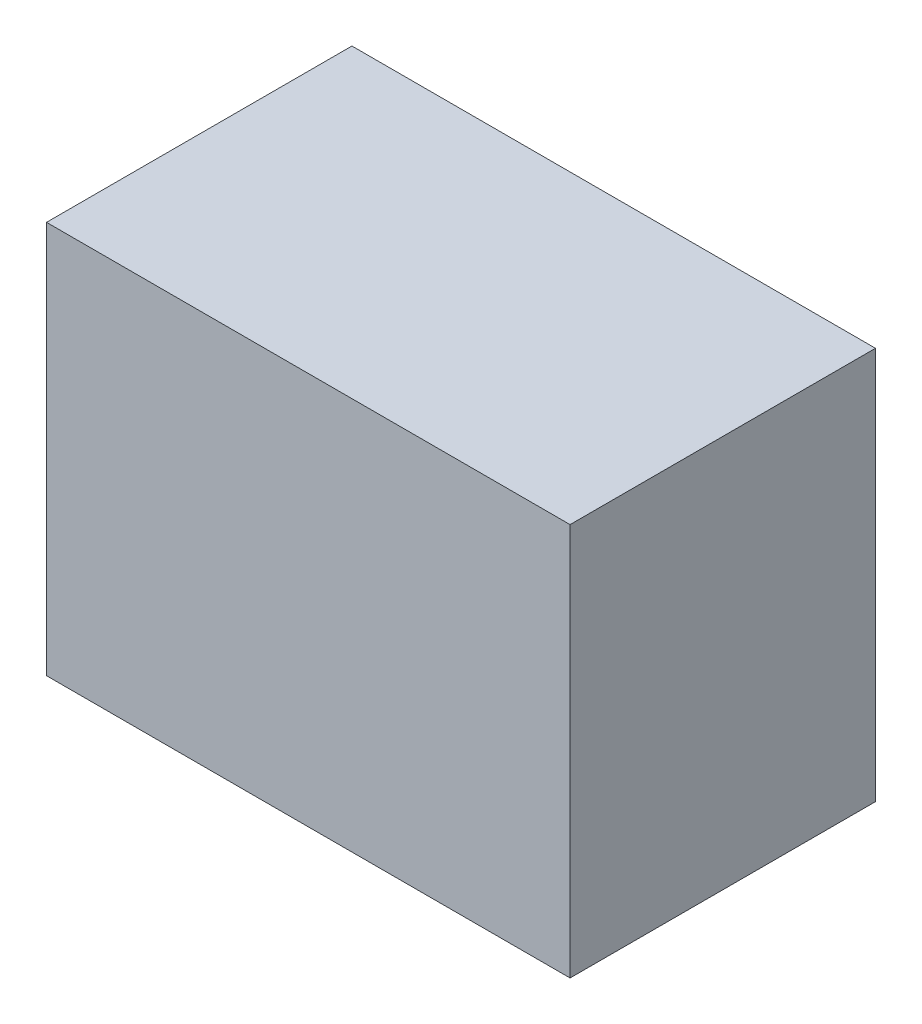
ISO-10303-21;
HEADER;
FILE_DESCRIPTION(('STEP AP214'),'2;1');
FILE_NAME('part.step','',(''),(''),'','','');
FILE_SCHEMA(('AUTOMOTIVE_DESIGN { 1 0 10303 214 1 1 1 1 }'));
ENDSEC;
DATA;
#1=APPLICATION_CONTEXT('core data for automotive mechanical design processes');
#2=APPLICATION_PROTOCOL_DEFINITION('international standard','automotive_design',2000,#1);
#3=PRODUCT_CONTEXT('',#1,'mechanical');
#4=PRODUCT('Part','Part','',(#3));
#5=PRODUCT_RELATED_PRODUCT_CATEGORY('part','',(#4));
#6=PRODUCT_DEFINITION_FORMATION('','',#4);
#7=PRODUCT_DEFINITION_CONTEXT('part definition',#1,'design');
#8=PRODUCT_DEFINITION('design','',#6,#7);
#9=PRODUCT_DEFINITION_SHAPE('','',#8);
#10=(LENGTH_UNIT() NAMED_UNIT(*) SI_UNIT(.MILLI.,.METRE.));
#11=(NAMED_UNIT(*) PLANE_ANGLE_UNIT() SI_UNIT($,.RADIAN.));
#12=(NAMED_UNIT(*) SI_UNIT($,.STERADIAN.) SOLID_ANGLE_UNIT());
#13=UNCERTAINTY_MEASURE_WITH_UNIT(LENGTH_MEASURE(1.E-05),#10,'distance_accuracy_value','');
#14=(GEOMETRIC_REPRESENTATION_CONTEXT(3) GLOBAL_UNCERTAINTY_ASSIGNED_CONTEXT((#13)) GLOBAL_UNIT_ASSIGNED_CONTEXT((#10,
#11,#12)) REPRESENTATION_CONTEXT('',''));
#15=CARTESIAN_POINT('',(0.,0.,0.));
#16=DIRECTION('',(0.,0.,1.));
#17=DIRECTION('',(1.,0.,0.));
#18=AXIS2_PLACEMENT_3D('',#15,#16,#17);
#19=CARTESIAN_POINT('',(152.4,228.6,88.9));
#20=DIRECTION('',(-1.,0.,0.));
#21=DIRECTION('',(0.,0.,1.));
#22=AXIS2_PLACEMENT_3D('',#19,#20,#21);
#23=PLANE('',#22);
#24=DIRECTION('',(0.,0.,-1.));
#25=VECTOR('',#24,1.);
#26=CARTESIAN_POINT('',(152.4,0.,88.9));
#27=LINE('',#26,#25);
#28=CARTESIAN_POINT('',(152.4,0.,88.9));
#29=VERTEX_POINT('',#28);
#30=CARTESIAN_POINT('',(152.4,0.,-88.9));
#31=VERTEX_POINT('',#30);
#32=EDGE_CURVE('E97',#29,#31,#27,.T.);
#33=ORIENTED_EDGE('',*,*,#32,.T.);
#34=DIRECTION('',(0.,-1.,0.));
#35=VECTOR('',#34,1.);
#36=CARTESIAN_POINT('',(152.4,228.6,-88.9));
#37=LINE('',#36,#35);
#38=CARTESIAN_POINT('',(152.4,228.6,-88.9));
#39=VERTEX_POINT('',#38);
#40=EDGE_CURVE('E11',#39,#31,#37,.T.);
#41=ORIENTED_EDGE('',*,*,#40,.F.);
#42=DIRECTION('',(0.,0.,-1.));
#43=VECTOR('',#42,1.);
#44=CARTESIAN_POINT('',(152.4,228.6,88.9));
#45=LINE('',#44,#43);
#46=CARTESIAN_POINT('',(152.4,228.6,88.9));
#47=VERTEX_POINT('',#46);
#48=EDGE_CURVE('E85',#47,#39,#45,.T.);
#49=ORIENTED_EDGE('',*,*,#48,.F.);
#50=DIRECTION('',(0.,-1.,0.));
#51=VECTOR('',#50,1.);
#52=CARTESIAN_POINT('',(152.4,228.6,88.9));
#53=LINE('',#52,#51);
#54=EDGE_CURVE('E93',#47,#29,#53,.T.);
#55=ORIENTED_EDGE('',*,*,#54,.T.);
#56=EDGE_LOOP('',(#33,#41,#49,#55));
#57=FACE_BOUND('',#56,.T.);
#58=ADVANCED_FACE('F34',(#57),#23,.F.);
#59=CARTESIAN_POINT('',(-152.4,228.6,-88.9));
#60=DIRECTION('',(0.,0.,1.));
#61=DIRECTION('',(1.,0.,0.));
#62=AXIS2_PLACEMENT_3D('',#59,#60,#61);
#63=PLANE('',#62);
#64=DIRECTION('',(-1.,0.,0.));
#65=VECTOR('',#64,1.);
#66=CARTESIAN_POINT('',(-152.4,0.,-88.9));
#67=LINE('',#66,#65);
#68=CARTESIAN_POINT('',(-152.4,0.,-88.9));
#69=VERTEX_POINT('',#68);
#70=EDGE_CURVE('E89',#31,#69,#67,.T.);
#71=ORIENTED_EDGE('',*,*,#70,.T.);
#72=DIRECTION('',(0.,-1.,0.));
#73=VECTOR('',#72,1.);
#74=CARTESIAN_POINT('',(-152.4,228.6,-88.9));
#75=LINE('',#74,#73);
#76=CARTESIAN_POINT('',(-152.4,228.6,-88.9));
#77=VERTEX_POINT('',#76);
#78=EDGE_CURVE('E42',#77,#69,#75,.T.);
#79=ORIENTED_EDGE('',*,*,#78,.F.);
#80=DIRECTION('',(-1.,0.,0.));
#81=VECTOR('',#80,1.);
#82=CARTESIAN_POINT('',(-152.4,228.6,-88.9));
#83=LINE('',#82,#81);
#84=EDGE_CURVE('E80',#39,#77,#83,.T.);
#85=ORIENTED_EDGE('',*,*,#84,.F.);
#86=ORIENTED_EDGE('',*,*,#40,.T.);
#87=EDGE_LOOP('',(#71,#79,#85,#86));
#88=FACE_BOUND('',#87,.T.);
#89=ADVANCED_FACE('F88',(#88),#63,.F.);
#90=CARTESIAN_POINT('',(-152.4,228.6,88.9));
#91=DIRECTION('',(1.,0.,0.));
#92=DIRECTION('',(0.,0.,-1.));
#93=AXIS2_PLACEMENT_3D('',#90,#91,#92);
#94=PLANE('',#93);
#95=CARTESIAN_POINT('',(-152.4,152.4,0.));
#96=DIRECTION('',(1.,0.,0.));
#97=DIRECTION('',(0.,0.,-1.));
#98=AXIS2_PLACEMENT_3D('',#95,#96,#97);
#99=CIRCLE('',#98,29.1374692972033);
#100=CARTESIAN_POINT('',(-152.4,152.4,-29.1374692972033));
#101=VERTEX_POINT('',#100);
#102=EDGE_CURVE('E113',#101,#101,#99,.T.);
#103=ORIENTED_EDGE('',*,*,#102,.T.);
#104=EDGE_LOOP('',(#103));
#105=FACE_BOUND('',#104,.T.);
#106=DIRECTION('',(0.,0.,1.));
#107=VECTOR('',#106,1.);
#108=CARTESIAN_POINT('',(-152.4,0.,88.9));
#109=LINE('',#108,#107);
#110=CARTESIAN_POINT('',(-152.4,0.,88.9));
#111=VERTEX_POINT('',#110);
#112=EDGE_CURVE('E67',#69,#111,#109,.T.);
#113=ORIENTED_EDGE('',*,*,#112,.T.);
#114=DIRECTION('',(0.,-1.,0.));
#115=VECTOR('',#114,1.);
#116=CARTESIAN_POINT('',(-152.4,228.6,88.9));
#117=LINE('',#116,#115);
#118=CARTESIAN_POINT('',(-152.4,228.6,88.9));
#119=VERTEX_POINT('',#118);
#120=EDGE_CURVE('E90',#119,#111,#117,.T.);
#121=ORIENTED_EDGE('',*,*,#120,.F.);
#122=DIRECTION('',(0.,0.,1.));
#123=VECTOR('',#122,1.);
#124=CARTESIAN_POINT('',(-152.4,228.6,88.9));
#125=LINE('',#124,#123);
#126=EDGE_CURVE('E83',#77,#119,#125,.T.);
#127=ORIENTED_EDGE('',*,*,#126,.F.);
#128=ORIENTED_EDGE('',*,*,#78,.T.);
#129=EDGE_LOOP('',(#113,#121,#127,#128));
#130=FACE_BOUND('',#129,.T.);
#131=ADVANCED_FACE('F91',(#105,#130),#94,.F.);
#132=CARTESIAN_POINT('',(-152.4,228.6,88.9));
#133=DIRECTION('',(0.,0.,-1.));
#134=DIRECTION('',(-1.,0.,0.));
#135=AXIS2_PLACEMENT_3D('',#132,#133,#134);
#136=PLANE('',#135);
#137=DIRECTION('',(1.,0.,0.));
#138=VECTOR('',#137,1.);
#139=CARTESIAN_POINT('',(-152.4,0.,88.9));
#140=LINE('',#139,#138);
#141=EDGE_CURVE('E73',#111,#29,#140,.T.);
#142=ORIENTED_EDGE('',*,*,#141,.T.);
#143=ORIENTED_EDGE('',*,*,#54,.F.);
#144=DIRECTION('',(1.,0.,0.));
#145=VECTOR('',#144,1.);
#146=CARTESIAN_POINT('',(-152.4,228.6,88.9));
#147=LINE('',#146,#145);
#148=EDGE_CURVE('E50',#119,#47,#147,.T.);
#149=ORIENTED_EDGE('',*,*,#148,.F.);
#150=ORIENTED_EDGE('',*,*,#120,.T.);
#151=EDGE_LOOP('',(#142,#143,#149,#150));
#152=FACE_BOUND('',#151,.T.);
#153=ADVANCED_FACE('F105',(#152),#136,.F.);
#154=CARTESIAN_POINT('',(0.,228.6,0.));
#155=DIRECTION('',(0.,-1.,0.));
#156=DIRECTION('',(0.,0.,-1.));
#157=AXIS2_PLACEMENT_3D('',#154,#155,#156);
#158=PLANE('',#157);
#159=ORIENTED_EDGE('',*,*,#48,.T.);
#160=ORIENTED_EDGE('',*,*,#84,.T.);
#161=ORIENTED_EDGE('',*,*,#126,.T.);
#162=ORIENTED_EDGE('',*,*,#148,.T.);
#163=EDGE_LOOP('',(#159,#160,#161,#162));
#164=FACE_BOUND('',#163,.T.);
#165=ADVANCED_FACE('F81',(#164),#158,.F.);
#166=CARTESIAN_POINT('',(0.,0.,0.));
#167=DIRECTION('',(0.,-1.,0.));
#168=DIRECTION('',(0.,0.,-1.));
#169=AXIS2_PLACEMENT_3D('',#166,#167,#168);
#170=PLANE('',#169);
#171=ORIENTED_EDGE('',*,*,#32,.F.);
#172=ORIENTED_EDGE('',*,*,#141,.F.);
#173=ORIENTED_EDGE('',*,*,#112,.F.);
#174=ORIENTED_EDGE('',*,*,#70,.F.);
#175=EDGE_LOOP('',(#171,#172,#173,#174));
#176=FACE_BOUND('',#175,.T.);
#177=ADVANCED_FACE('F108',(#176),#170,.T.);
#178=CARTESIAN_POINT('',(-158.75,152.4,0.));
#179=DIRECTION('',(-1.,0.,0.));
#180=DIRECTION('',(0.,0.,1.));
#181=AXIS2_PLACEMENT_3D('',#178,#179,#180);
#182=PLANE('',#181);
#183=CARTESIAN_POINT('',(-158.75,152.4,0.));
#184=DIRECTION('',(1.,0.,0.));
#185=DIRECTION('',(0.,0.,-1.));
#186=AXIS2_PLACEMENT_3D('',#183,#184,#185);
#187=CIRCLE('',#186,29.1374692972033);
#188=CARTESIAN_POINT('',(-158.75,152.4,-29.1374692972033));
#189=VERTEX_POINT('',#188);
#190=EDGE_CURVE('E100',#189,#189,#187,.T.);
#191=ORIENTED_EDGE('',*,*,#190,.F.);
#192=EDGE_LOOP('',(#191));
#193=FACE_BOUND('',#192,.T.);
#194=ADVANCED_FACE('F120',(#193),#182,.T.);
#195=CARTESIAN_POINT('',(-152.4,152.4,0.));
#196=DIRECTION('',(1.,0.,0.));
#197=DIRECTION('',(0.,0.,-1.));
#198=AXIS2_PLACEMENT_3D('',#195,#196,#197);
#199=CYLINDRICAL_SURFACE('',#198,29.1374692972033);
#200=ORIENTED_EDGE('',*,*,#190,.T.);
#201=EDGE_LOOP('',(#200));
#202=FACE_BOUND('',#201,.T.);
#203=ORIENTED_EDGE('',*,*,#102,.F.);
#204=EDGE_LOOP('',(#203));
#205=FACE_BOUND('',#204,.T.);
#206=ADVANCED_FACE('F118',(#202,#205),#199,.T.);
#207=CLOSED_SHELL('',(#58,#89,#131,#153,#165,#177,#194,#206));
#208=MANIFOLD_SOLID_BREP('B2',#207);
#209=ADVANCED_BREP_SHAPE_REPRESENTATION('',(#18,#208),#14);
#210=SHAPE_DEFINITION_REPRESENTATION(#9,#209);
ENDSEC;
END-ISO-10303-21;
